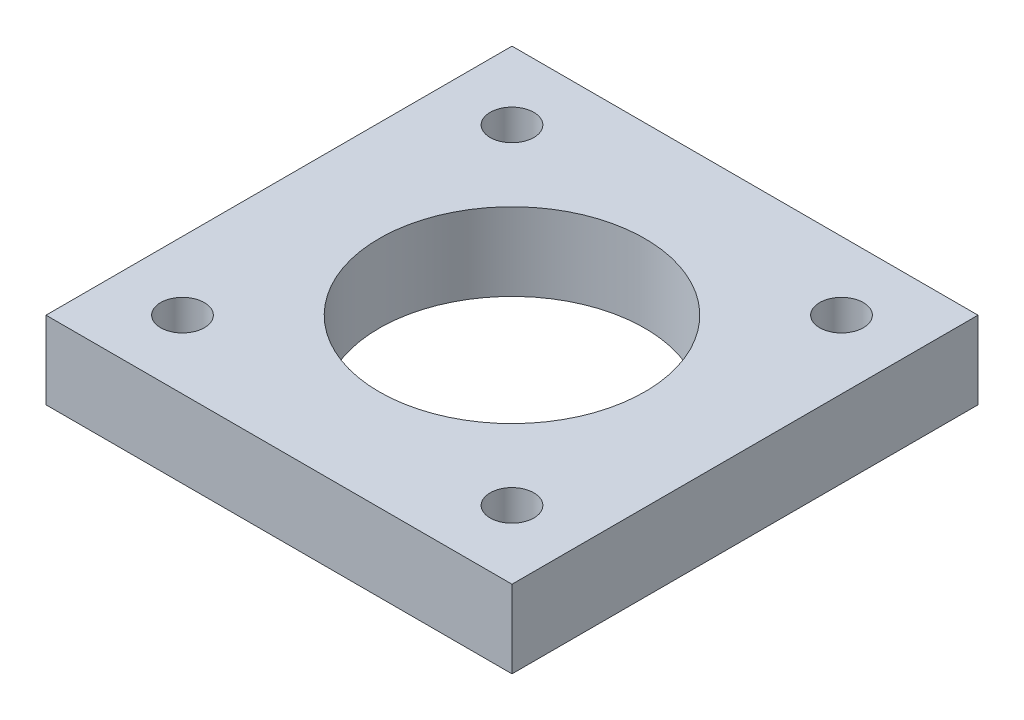
ISO-10303-21;
HEADER;
FILE_DESCRIPTION(('STEP AP214'),'2;1');
FILE_NAME('part.step','',(''),(''),'','','');
FILE_SCHEMA(('AUTOMOTIVE_DESIGN { 1 0 10303 214 1 1 1 1 }'));
ENDSEC;
DATA;
#1=APPLICATION_CONTEXT('core data for automotive mechanical design processes');
#2=APPLICATION_PROTOCOL_DEFINITION('international standard','automotive_design',2000,#1);
#3=PRODUCT_CONTEXT('',#1,'mechanical');
#4=PRODUCT('Part','Part','',(#3));
#5=PRODUCT_RELATED_PRODUCT_CATEGORY('part','',(#4));
#6=PRODUCT_DEFINITION_FORMATION('','',#4);
#7=PRODUCT_DEFINITION_CONTEXT('part definition',#1,'design');
#8=PRODUCT_DEFINITION('design','',#6,#7);
#9=PRODUCT_DEFINITION_SHAPE('','',#8);
#10=(LENGTH_UNIT() NAMED_UNIT(*) SI_UNIT(.MILLI.,.METRE.));
#11=(NAMED_UNIT(*) PLANE_ANGLE_UNIT() SI_UNIT($,.RADIAN.));
#12=(NAMED_UNIT(*) SI_UNIT($,.STERADIAN.) SOLID_ANGLE_UNIT());
#13=UNCERTAINTY_MEASURE_WITH_UNIT(LENGTH_MEASURE(1.E-05),#10,'distance_accuracy_value','');
#14=(GEOMETRIC_REPRESENTATION_CONTEXT(3) GLOBAL_UNCERTAINTY_ASSIGNED_CONTEXT((#13)) GLOBAL_UNIT_ASSIGNED_CONTEXT((#10,
#11,#12)) REPRESENTATION_CONTEXT('',''));
#15=CARTESIAN_POINT('',(0.,0.,0.));
#16=DIRECTION('',(0.,0.,1.));
#17=DIRECTION('',(1.,0.,0.));
#18=AXIS2_PLACEMENT_3D('',#15,#16,#17);
#19=CARTESIAN_POINT('',(0.,6.35,-38.1));
#20=DIRECTION('',(0.,-1.,0.));
#21=DIRECTION('',(0.,0.,-1.));
#22=AXIS2_PLACEMENT_3D('',#19,#20,#21);
#23=PLANE('',#22);
#24=CARTESIAN_POINT('',(32.5203841816037,6.35,-5.57961581839627));
#25=DIRECTION('',(0.,1.,0.));
#26=DIRECTION('',(0.,0.,1.));
#27=AXIS2_PLACEMENT_3D('',#24,#25,#26);
#28=CIRCLE('',#27,1.7859375);
#29=CARTESIAN_POINT('',(32.5203841816037,6.35,-3.79367831839627));
#30=VERTEX_POINT('',#29);
#31=EDGE_CURVE('E124',#30,#30,#28,.T.);
#32=ORIENTED_EDGE('',*,*,#31,.F.);
#33=EDGE_LOOP('',(#32));
#34=FACE_BOUND('',#33,.T.);
#35=CARTESIAN_POINT('',(5.57961581839627,6.35,-32.5203841816037));
#36=DIRECTION('',(0.,1.,0.));
#37=DIRECTION('',(0.,0.,1.));
#38=AXIS2_PLACEMENT_3D('',#35,#36,#37);
#39=CIRCLE('',#38,1.7859375);
#40=CARTESIAN_POINT('',(5.57961581839627,6.35,-30.7344466816037));
#41=VERTEX_POINT('',#40);
#42=EDGE_CURVE('E112',#41,#41,#39,.T.);
#43=ORIENTED_EDGE('',*,*,#42,.F.);
#44=EDGE_LOOP('',(#43));
#45=FACE_BOUND('',#44,.T.);
#46=DIRECTION('',(0.,0.,1.));
#47=VECTOR('',#46,1.);
#48=CARTESIAN_POINT('',(0.,6.35,0.));
#49=LINE('',#48,#47);
#50=CARTESIAN_POINT('',(0.,6.35,-38.1));
#51=VERTEX_POINT('',#50);
#52=CARTESIAN_POINT('',(0.,6.35,0.));
#53=VERTEX_POINT('',#52);
#54=EDGE_CURVE('E82',#51,#53,#49,.T.);
#55=ORIENTED_EDGE('',*,*,#54,.T.);
#56=DIRECTION('',(1.,0.,0.));
#57=VECTOR('',#56,1.);
#58=CARTESIAN_POINT('',(0.,6.35,0.));
#59=LINE('',#58,#57);
#60=CARTESIAN_POINT('',(38.1,6.35,0.));
#61=VERTEX_POINT('',#60);
#62=EDGE_CURVE('E77',#53,#61,#59,.T.);
#63=ORIENTED_EDGE('',*,*,#62,.T.);
#64=DIRECTION('',(0.,0.,-1.));
#65=VECTOR('',#64,1.);
#66=CARTESIAN_POINT('',(38.1,6.35,0.));
#67=LINE('',#66,#65);
#68=CARTESIAN_POINT('',(38.1,6.35,-38.1));
#69=VERTEX_POINT('',#68);
#70=EDGE_CURVE('E80',#61,#69,#67,.T.);
#71=ORIENTED_EDGE('',*,*,#70,.T.);
#72=DIRECTION('',(-1.,0.,0.));
#73=VECTOR('',#72,1.);
#74=CARTESIAN_POINT('',(0.,6.35,-38.1));
#75=LINE('',#74,#73);
#76=EDGE_CURVE('E47',#69,#51,#75,.T.);
#77=ORIENTED_EDGE('',*,*,#76,.T.);
#78=EDGE_LOOP('',(#55,#63,#71,#77));
#79=FACE_BOUND('',#78,.T.);
#80=CARTESIAN_POINT('',(19.05,6.35,-19.05));
#81=DIRECTION('',(0.,1.,0.));
#82=DIRECTION('',(0.,0.,1.));
#83=AXIS2_PLACEMENT_3D('',#80,#81,#82);
#84=CIRCLE('',#83,10.8585);
#85=CARTESIAN_POINT('',(19.05,6.35,-8.1915));
#86=VERTEX_POINT('',#85);
#87=EDGE_CURVE('E97',#86,#86,#84,.T.);
#88=ORIENTED_EDGE('',*,*,#87,.F.);
#89=EDGE_LOOP('',(#88));
#90=FACE_BOUND('',#89,.T.);
#91=CARTESIAN_POINT('',(32.5203841816037,6.35,-32.5203841816037));
#92=DIRECTION('',(0.,1.,0.));
#93=DIRECTION('',(0.,0.,1.));
#94=AXIS2_PLACEMENT_3D('',#91,#92,#93);
#95=CIRCLE('',#94,1.7859375);
#96=CARTESIAN_POINT('',(32.5203841816037,6.35,-30.7344466816037));
#97=VERTEX_POINT('',#96);
#98=EDGE_CURVE('E118',#97,#97,#95,.T.);
#99=ORIENTED_EDGE('',*,*,#98,.F.);
#100=EDGE_LOOP('',(#99));
#101=FACE_BOUND('',#100,.T.);
#102=CARTESIAN_POINT('',(5.57961581839627,6.35,-5.57961581839627));
#103=DIRECTION('',(0.,1.,0.));
#104=DIRECTION('',(0.,0.,1.));
#105=AXIS2_PLACEMENT_3D('',#102,#103,#104);
#106=CIRCLE('',#105,1.7859375);
#107=CARTESIAN_POINT('',(5.57961581839627,6.35,-3.79367831839627));
#108=VERTEX_POINT('',#107);
#109=EDGE_CURVE('E130',#108,#108,#106,.T.);
#110=ORIENTED_EDGE('',*,*,#109,.F.);
#111=EDGE_LOOP('',(#110));
#112=FACE_BOUND('',#111,.T.);
#113=ADVANCED_FACE('F30',(#34,#45,#79,#90,#101,#112),#23,.F.);
#114=CARTESIAN_POINT('',(0.,0.,-38.1));
#115=DIRECTION('',(0.,-1.,0.));
#116=DIRECTION('',(0.,0.,-1.));
#117=AXIS2_PLACEMENT_3D('',#114,#115,#116);
#118=PLANE('',#117);
#119=CARTESIAN_POINT('',(32.5203841816037,0.,-5.57961581839627));
#120=DIRECTION('',(0.,1.,0.));
#121=DIRECTION('',(0.,0.,1.));
#122=AXIS2_PLACEMENT_3D('',#119,#120,#121);
#123=CIRCLE('',#122,1.7859375);
#124=CARTESIAN_POINT('',(32.5203841816037,0.,-3.79367831839627));
#125=VERTEX_POINT('',#124);
#126=EDGE_CURVE('E127',#125,#125,#123,.T.);
#127=ORIENTED_EDGE('',*,*,#126,.T.);
#128=EDGE_LOOP('',(#127));
#129=FACE_BOUND('',#128,.T.);
#130=CARTESIAN_POINT('',(5.57961581839627,0.,-32.5203841816037));
#131=DIRECTION('',(0.,1.,0.));
#132=DIRECTION('',(0.,0.,1.));
#133=AXIS2_PLACEMENT_3D('',#130,#131,#132);
#134=CIRCLE('',#133,1.7859375);
#135=CARTESIAN_POINT('',(5.57961581839627,0.,-30.7344466816037));
#136=VERTEX_POINT('',#135);
#137=EDGE_CURVE('E115',#136,#136,#134,.T.);
#138=ORIENTED_EDGE('',*,*,#137,.T.);
#139=EDGE_LOOP('',(#138));
#140=FACE_BOUND('',#139,.T.);
#141=DIRECTION('',(0.,0.,1.));
#142=VECTOR('',#141,1.);
#143=CARTESIAN_POINT('',(0.,0.,0.));
#144=LINE('',#143,#142);
#145=CARTESIAN_POINT('',(0.,0.,-38.1));
#146=VERTEX_POINT('',#145);
#147=CARTESIAN_POINT('',(0.,0.,0.));
#148=VERTEX_POINT('',#147);
#149=EDGE_CURVE('E94',#146,#148,#144,.T.);
#150=ORIENTED_EDGE('',*,*,#149,.F.);
#151=DIRECTION('',(-1.,0.,0.));
#152=VECTOR('',#151,1.);
#153=CARTESIAN_POINT('',(0.,0.,-38.1));
#154=LINE('',#153,#152);
#155=CARTESIAN_POINT('',(38.1,0.,-38.1));
#156=VERTEX_POINT('',#155);
#157=EDGE_CURVE('E70',#156,#146,#154,.T.);
#158=ORIENTED_EDGE('',*,*,#157,.F.);
#159=DIRECTION('',(0.,0.,-1.));
#160=VECTOR('',#159,1.);
#161=CARTESIAN_POINT('',(38.1,0.,0.));
#162=LINE('',#161,#160);
#163=CARTESIAN_POINT('',(38.1,0.,0.));
#164=VERTEX_POINT('',#163);
#165=EDGE_CURVE('E64',#164,#156,#162,.T.);
#166=ORIENTED_EDGE('',*,*,#165,.F.);
#167=DIRECTION('',(1.,0.,0.));
#168=VECTOR('',#167,1.);
#169=CARTESIAN_POINT('',(0.,0.,0.));
#170=LINE('',#169,#168);
#171=EDGE_CURVE('E86',#148,#164,#170,.T.);
#172=ORIENTED_EDGE('',*,*,#171,.F.);
#173=EDGE_LOOP('',(#150,#158,#166,#172));
#174=FACE_BOUND('',#173,.T.);
#175=CARTESIAN_POINT('',(19.05,0.,-19.05));
#176=DIRECTION('',(0.,1.,0.));
#177=DIRECTION('',(0.,0.,1.));
#178=AXIS2_PLACEMENT_3D('',#175,#176,#177);
#179=CIRCLE('',#178,10.8585);
#180=CARTESIAN_POINT('',(19.05,0.,-8.1915));
#181=VERTEX_POINT('',#180);
#182=EDGE_CURVE('E109',#181,#181,#179,.T.);
#183=ORIENTED_EDGE('',*,*,#182,.T.);
#184=EDGE_LOOP('',(#183));
#185=FACE_BOUND('',#184,.T.);
#186=CARTESIAN_POINT('',(32.5203841816037,0.,-32.5203841816037));
#187=DIRECTION('',(0.,1.,0.));
#188=DIRECTION('',(0.,0.,1.));
#189=AXIS2_PLACEMENT_3D('',#186,#187,#188);
#190=CIRCLE('',#189,1.7859375);
#191=CARTESIAN_POINT('',(32.5203841816037,0.,-30.7344466816037));
#192=VERTEX_POINT('',#191);
#193=EDGE_CURVE('E121',#192,#192,#190,.T.);
#194=ORIENTED_EDGE('',*,*,#193,.T.);
#195=EDGE_LOOP('',(#194));
#196=FACE_BOUND('',#195,.T.);
#197=CARTESIAN_POINT('',(5.57961581839627,0.,-5.57961581839627));
#198=DIRECTION('',(0.,1.,0.));
#199=DIRECTION('',(0.,0.,1.));
#200=AXIS2_PLACEMENT_3D('',#197,#198,#199);
#201=CIRCLE('',#200,1.7859375);
#202=CARTESIAN_POINT('',(5.57961581839627,0.,-3.79367831839627));
#203=VERTEX_POINT('',#202);
#204=EDGE_CURVE('E133',#203,#203,#201,.T.);
#205=ORIENTED_EDGE('',*,*,#204,.T.);
#206=EDGE_LOOP('',(#205));
#207=FACE_BOUND('',#206,.T.);
#208=ADVANCED_FACE('F105',(#129,#140,#174,#185,#196,#207),#118,.T.);
#209=CARTESIAN_POINT('',(0.,6.35,0.));
#210=DIRECTION('',(1.,0.,0.));
#211=DIRECTION('',(0.,0.,-1.));
#212=AXIS2_PLACEMENT_3D('',#209,#210,#211);
#213=PLANE('',#212);
#214=ORIENTED_EDGE('',*,*,#149,.T.);
#215=DIRECTION('',(0.,-1.,0.));
#216=VECTOR('',#215,1.);
#217=CARTESIAN_POINT('',(0.,6.35,0.));
#218=LINE('',#217,#216);
#219=EDGE_CURVE('E11',#53,#148,#218,.T.);
#220=ORIENTED_EDGE('',*,*,#219,.F.);
#221=ORIENTED_EDGE('',*,*,#54,.F.);
#222=DIRECTION('',(0.,-1.,0.));
#223=VECTOR('',#222,1.);
#224=CARTESIAN_POINT('',(0.,6.35,-38.1));
#225=LINE('',#224,#223);
#226=EDGE_CURVE('E90',#51,#146,#225,.T.);
#227=ORIENTED_EDGE('',*,*,#226,.T.);
#228=EDGE_LOOP('',(#214,#220,#221,#227));
#229=FACE_BOUND('',#228,.T.);
#230=ADVANCED_FACE('F32',(#229),#213,.F.);
#231=CARTESIAN_POINT('',(0.,6.35,0.));
#232=DIRECTION('',(0.,0.,-1.));
#233=DIRECTION('',(-1.,0.,0.));
#234=AXIS2_PLACEMENT_3D('',#231,#232,#233);
#235=PLANE('',#234);
#236=ORIENTED_EDGE('',*,*,#171,.T.);
#237=DIRECTION('',(0.,-1.,0.));
#238=VECTOR('',#237,1.);
#239=CARTESIAN_POINT('',(38.1,6.35,0.));
#240=LINE('',#239,#238);
#241=EDGE_CURVE('E39',#61,#164,#240,.T.);
#242=ORIENTED_EDGE('',*,*,#241,.F.);
#243=ORIENTED_EDGE('',*,*,#62,.F.);
#244=ORIENTED_EDGE('',*,*,#219,.T.);
#245=EDGE_LOOP('',(#236,#242,#243,#244));
#246=FACE_BOUND('',#245,.T.);
#247=ADVANCED_FACE('F85',(#246),#235,.F.);
#248=CARTESIAN_POINT('',(38.1,6.35,0.));
#249=DIRECTION('',(-1.,0.,0.));
#250=DIRECTION('',(0.,0.,1.));
#251=AXIS2_PLACEMENT_3D('',#248,#249,#250);
#252=PLANE('',#251);
#253=ORIENTED_EDGE('',*,*,#165,.T.);
#254=DIRECTION('',(0.,-1.,0.));
#255=VECTOR('',#254,1.);
#256=CARTESIAN_POINT('',(38.1,6.35,-38.1));
#257=LINE('',#256,#255);
#258=EDGE_CURVE('E87',#69,#156,#257,.T.);
#259=ORIENTED_EDGE('',*,*,#258,.F.);
#260=ORIENTED_EDGE('',*,*,#70,.F.);
#261=ORIENTED_EDGE('',*,*,#241,.T.);
#262=EDGE_LOOP('',(#253,#259,#260,#261));
#263=FACE_BOUND('',#262,.T.);
#264=ADVANCED_FACE('F88',(#263),#252,.F.);
#265=CARTESIAN_POINT('',(0.,6.35,-38.1));
#266=DIRECTION('',(0.,0.,1.));
#267=DIRECTION('',(1.,0.,0.));
#268=AXIS2_PLACEMENT_3D('',#265,#266,#267);
#269=PLANE('',#268);
#270=ORIENTED_EDGE('',*,*,#157,.T.);
#271=ORIENTED_EDGE('',*,*,#226,.F.);
#272=ORIENTED_EDGE('',*,*,#76,.F.);
#273=ORIENTED_EDGE('',*,*,#258,.T.);
#274=EDGE_LOOP('',(#270,#271,#272,#273));
#275=FACE_BOUND('',#274,.T.);
#276=ADVANCED_FACE('F102',(#275),#269,.F.);
#277=CARTESIAN_POINT('',(19.05,6.35,-19.05));
#278=DIRECTION('',(0.,-1.,0.));
#279=DIRECTION('',(0.,0.,-1.));
#280=AXIS2_PLACEMENT_3D('',#277,#278,#279);
#281=CYLINDRICAL_SURFACE('',#280,10.8585);
#282=ORIENTED_EDGE('',*,*,#87,.T.);
#283=EDGE_LOOP('',(#282));
#284=FACE_BOUND('',#283,.T.);
#285=ORIENTED_EDGE('',*,*,#182,.F.);
#286=EDGE_LOOP('',(#285));
#287=FACE_BOUND('',#286,.T.);
#288=ADVANCED_FACE('F153',(#284,#287),#281,.F.);
#289=CARTESIAN_POINT('',(5.57961581839627,6.35,-32.5203841816037));
#290=DIRECTION('',(0.,-1.,0.));
#291=DIRECTION('',(0.,0.,-1.));
#292=AXIS2_PLACEMENT_3D('',#289,#290,#291);
#293=CYLINDRICAL_SURFACE('',#292,1.7859375);
#294=ORIENTED_EDGE('',*,*,#42,.T.);
#295=EDGE_LOOP('',(#294));
#296=FACE_BOUND('',#295,.T.);
#297=ORIENTED_EDGE('',*,*,#137,.F.);
#298=EDGE_LOOP('',(#297));
#299=FACE_BOUND('',#298,.T.);
#300=ADVANCED_FACE('F199',(#296,#299),#293,.F.);
#301=CARTESIAN_POINT('',(32.5203841816037,6.35,-32.5203841816037));
#302=DIRECTION('',(0.,-1.,0.));
#303=DIRECTION('',(0.,0.,-1.));
#304=AXIS2_PLACEMENT_3D('',#301,#302,#303);
#305=CYLINDRICAL_SURFACE('',#304,1.7859375);
#306=ORIENTED_EDGE('',*,*,#98,.T.);
#307=EDGE_LOOP('',(#306));
#308=FACE_BOUND('',#307,.T.);
#309=ORIENTED_EDGE('',*,*,#193,.F.);
#310=EDGE_LOOP('',(#309));
#311=FACE_BOUND('',#310,.T.);
#312=ADVANCED_FACE('F207',(#308,#311),#305,.F.);
#313=CARTESIAN_POINT('',(32.5203841816037,6.35,-5.57961581839627));
#314=DIRECTION('',(0.,-1.,0.));
#315=DIRECTION('',(0.,0.,-1.));
#316=AXIS2_PLACEMENT_3D('',#313,#314,#315);
#317=CYLINDRICAL_SURFACE('',#316,1.7859375);
#318=ORIENTED_EDGE('',*,*,#31,.T.);
#319=EDGE_LOOP('',(#318));
#320=FACE_BOUND('',#319,.T.);
#321=ORIENTED_EDGE('',*,*,#126,.F.);
#322=EDGE_LOOP('',(#321));
#323=FACE_BOUND('',#322,.T.);
#324=ADVANCED_FACE('F215',(#320,#323),#317,.F.);
#325=CARTESIAN_POINT('',(5.57961581839627,6.35,-5.57961581839627));
#326=DIRECTION('',(0.,-1.,0.));
#327=DIRECTION('',(0.,0.,-1.));
#328=AXIS2_PLACEMENT_3D('',#325,#326,#327);
#329=CYLINDRICAL_SURFACE('',#328,1.7859375);
#330=ORIENTED_EDGE('',*,*,#109,.T.);
#331=EDGE_LOOP('',(#330));
#332=FACE_BOUND('',#331,.T.);
#333=ORIENTED_EDGE('',*,*,#204,.F.);
#334=EDGE_LOOP('',(#333));
#335=FACE_BOUND('',#334,.T.);
#336=ADVANCED_FACE('F139',(#332,#335),#329,.F.);
#337=CLOSED_SHELL('',(#113,#208,#230,#247,#264,#276,#288,#300,#312,#324,#336));
#338=MANIFOLD_SOLID_BREP('B2',#337);
#339=ADVANCED_BREP_SHAPE_REPRESENTATION('',(#18,#338),#14);
#340=SHAPE_DEFINITION_REPRESENTATION(#9,#339);
ENDSEC;
END-ISO-10303-21;
